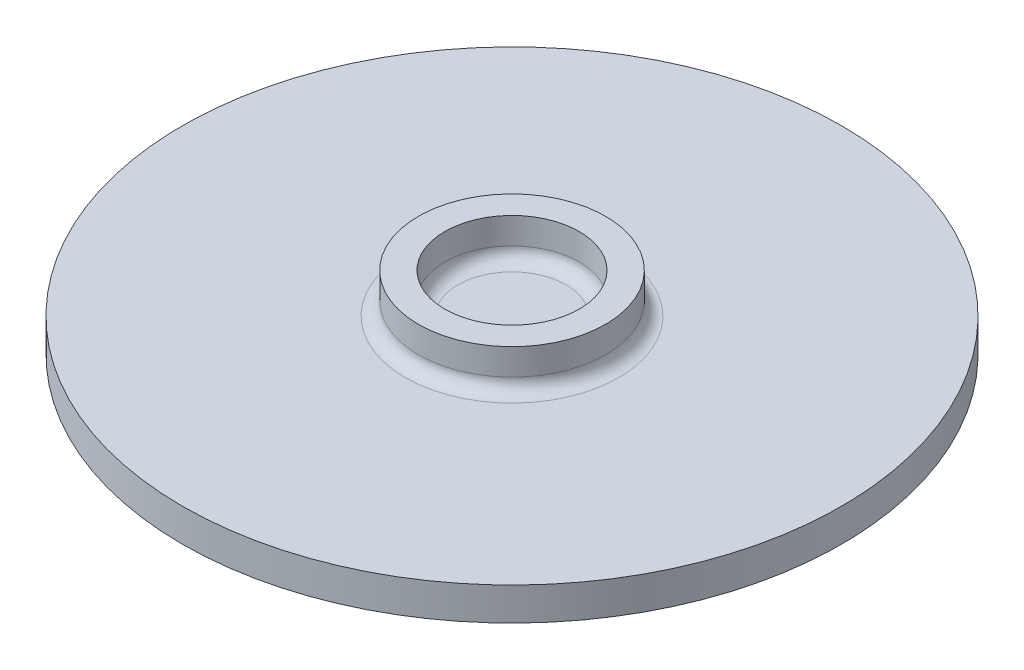
ISO-10303-21;
HEADER;
FILE_DESCRIPTION(('STEP AP214'),'2;1');
FILE_NAME('part.step','',(''),(''),'','','');
FILE_SCHEMA(('AUTOMOTIVE_DESIGN { 1 0 10303 214 1 1 1 1 }'));
ENDSEC;
DATA;
#1=APPLICATION_CONTEXT('core data for automotive mechanical design processes');
#2=APPLICATION_PROTOCOL_DEFINITION('international standard','automotive_design',2000,#1);
#3=PRODUCT_CONTEXT('',#1,'mechanical');
#4=PRODUCT('Part','Part','',(#3));
#5=PRODUCT_RELATED_PRODUCT_CATEGORY('part','',(#4));
#6=PRODUCT_DEFINITION_FORMATION('','',#4);
#7=PRODUCT_DEFINITION_CONTEXT('part definition',#1,'design');
#8=PRODUCT_DEFINITION('design','',#6,#7);
#9=PRODUCT_DEFINITION_SHAPE('','',#8);
#10=(LENGTH_UNIT() NAMED_UNIT(*) SI_UNIT(.MILLI.,.METRE.));
#11=(NAMED_UNIT(*) PLANE_ANGLE_UNIT() SI_UNIT($,.RADIAN.));
#12=(NAMED_UNIT(*) SI_UNIT($,.STERADIAN.) SOLID_ANGLE_UNIT());
#13=UNCERTAINTY_MEASURE_WITH_UNIT(LENGTH_MEASURE(1.E-05),#10,'distance_accuracy_value','');
#14=(GEOMETRIC_REPRESENTATION_CONTEXT(3) GLOBAL_UNCERTAINTY_ASSIGNED_CONTEXT((#13)) GLOBAL_UNIT_ASSIGNED_CONTEXT((#10,
#11,#12)) REPRESENTATION_CONTEXT('',''));
#15=CARTESIAN_POINT('',(0.,0.,0.));
#16=DIRECTION('',(0.,0.,1.));
#17=DIRECTION('',(1.,0.,0.));
#18=AXIS2_PLACEMENT_3D('',#15,#16,#17);
#19=CARTESIAN_POINT('',(0.,2.5,0.));
#20=DIRECTION('',(0.,-1.,0.));
#21=DIRECTION('',(0.,0.,-1.));
#22=AXIS2_PLACEMENT_3D('',#19,#20,#21);
#23=CYLINDRICAL_SURFACE('',#22,25.);
#24=CARTESIAN_POINT('',(0.,2.5,0.));
#25=DIRECTION('',(0.,1.,0.));
#26=DIRECTION('',(0.,0.,1.));
#27=AXIS2_PLACEMENT_3D('',#24,#25,#26);
#28=CIRCLE('',#27,25.);
#29=CARTESIAN_POINT('',(0.,2.5,25.));
#30=VERTEX_POINT('',#29);
#31=EDGE_CURVE('E56',#30,#30,#28,.T.);
#32=ORIENTED_EDGE('',*,*,#31,.F.);
#33=EDGE_LOOP('',(#32));
#34=FACE_BOUND('',#33,.T.);
#35=CARTESIAN_POINT('',(0.,0.,0.));
#36=DIRECTION('',(0.,1.,0.));
#37=DIRECTION('',(0.,0.,1.));
#38=AXIS2_PLACEMENT_3D('',#35,#36,#37);
#39=CIRCLE('',#38,25.);
#40=CARTESIAN_POINT('',(0.,0.,25.));
#41=VERTEX_POINT('',#40);
#42=EDGE_CURVE('E57',#41,#41,#39,.T.);
#43=ORIENTED_EDGE('',*,*,#42,.T.);
#44=EDGE_LOOP('',(#43));
#45=FACE_BOUND('',#44,.T.);
#46=ADVANCED_FACE('F36',(#34,#45),#23,.T.);
#47=CARTESIAN_POINT('',(0.,2.5,0.));
#48=DIRECTION('',(0.,1.,0.));
#49=DIRECTION('',(0.,0.,1.));
#50=AXIS2_PLACEMENT_3D('',#47,#48,#49);
#51=PLANE('',#50);
#52=CARTESIAN_POINT('',(0.,2.5,0.));
#53=DIRECTION('',(0.,1.,0.));
#54=DIRECTION('',(0.,0.,1.));
#55=AXIS2_PLACEMENT_3D('',#52,#53,#54);
#56=CIRCLE('',#55,8.10000000000001);
#57=CARTESIAN_POINT('',(0.,2.5,8.10000000000001));
#58=VERTEX_POINT('',#57);
#59=EDGE_CURVE('E10',#58,#58,#56,.F.);
#60=ORIENTED_EDGE('',*,*,#59,.T.);
#61=EDGE_LOOP('',(#60));
#62=FACE_BOUND('',#61,.T.);
#63=ORIENTED_EDGE('',*,*,#31,.T.);
#64=EDGE_LOOP('',(#63));
#65=FACE_BOUND('',#64,.T.);
#66=ADVANCED_FACE('F82',(#62,#65),#51,.T.);
#67=CARTESIAN_POINT('',(0.,0.,0.));
#68=DIRECTION('',(0.,1.,0.));
#69=DIRECTION('',(0.,0.,1.));
#70=AXIS2_PLACEMENT_3D('',#67,#68,#69);
#71=PLANE('',#70);
#72=ORIENTED_EDGE('',*,*,#42,.F.);
#73=EDGE_LOOP('',(#72));
#74=FACE_BOUND('',#73,.T.);
#75=ADVANCED_FACE('F74',(#74),#71,.F.);
#76=CARTESIAN_POINT('',(0.,5.5,0.));
#77=DIRECTION('',(0.,1.,0.));
#78=DIRECTION('',(0.,0.,1.));
#79=AXIS2_PLACEMENT_3D('',#76,#77,#78);
#80=PLANE('',#79);
#81=CARTESIAN_POINT('',(0.,5.5,0.));
#82=DIRECTION('',(0.,1.,0.));
#83=DIRECTION('',(0.,0.,1.));
#84=AXIS2_PLACEMENT_3D('',#81,#82,#83);
#85=CIRCLE('',#84,7.10000000000001);
#86=CARTESIAN_POINT('',(0.,5.5,7.10000000000001));
#87=VERTEX_POINT('',#86);
#88=EDGE_CURVE('E60',#87,#87,#85,.T.);
#89=ORIENTED_EDGE('',*,*,#88,.T.);
#90=EDGE_LOOP('',(#89));
#91=FACE_BOUND('',#90,.T.);
#92=CARTESIAN_POINT('',(0.,5.5,0.));
#93=DIRECTION('',(0.,1.,0.));
#94=DIRECTION('',(0.,0.,1.));
#95=AXIS2_PLACEMENT_3D('',#92,#93,#94);
#96=CIRCLE('',#95,5.10000000000001);
#97=CARTESIAN_POINT('',(0.,5.5,5.10000000000001));
#98=VERTEX_POINT('',#97);
#99=EDGE_CURVE('E65',#98,#98,#96,.T.);
#100=ORIENTED_EDGE('',*,*,#99,.F.);
#101=EDGE_LOOP('',(#100));
#102=FACE_BOUND('',#101,.T.);
#103=ADVANCED_FACE('F71',(#91,#102),#80,.T.);
#104=CARTESIAN_POINT('',(0.,5.5,0.));
#105=DIRECTION('',(0.,-1.,0.));
#106=DIRECTION('',(0.,0.,-1.));
#107=AXIS2_PLACEMENT_3D('',#104,#105,#106);
#108=CYLINDRICAL_SURFACE('',#107,7.10000000000001);
#109=CARTESIAN_POINT('',(0.,3.5,0.));
#110=DIRECTION('',(0.,1.,0.));
#111=DIRECTION('',(0.,0.,1.));
#112=AXIS2_PLACEMENT_3D('',#109,#110,#111);
#113=CIRCLE('',#112,7.10000000000001);
#114=CARTESIAN_POINT('',(0.,3.5,7.10000000000001));
#115=VERTEX_POINT('',#114);
#116=EDGE_CURVE('E43',#115,#115,#113,.T.);
#117=ORIENTED_EDGE('',*,*,#116,.T.);
#118=EDGE_LOOP('',(#117));
#119=FACE_BOUND('',#118,.T.);
#120=ORIENTED_EDGE('',*,*,#88,.F.);
#121=EDGE_LOOP('',(#120));
#122=FACE_BOUND('',#121,.T.);
#123=ADVANCED_FACE('F73',(#119,#122),#108,.T.);
#124=CARTESIAN_POINT('',(0.,5.5,0.));
#125=DIRECTION('',(0.,-1.,0.));
#126=DIRECTION('',(0.,0.,-1.));
#127=AXIS2_PLACEMENT_3D('',#124,#125,#126);
#128=CYLINDRICAL_SURFACE('',#127,5.10000000000001);
#129=CARTESIAN_POINT('',(0.,3.5,0.));
#130=DIRECTION('',(0.,1.,0.));
#131=DIRECTION('',(0.,0.,1.));
#132=AXIS2_PLACEMENT_3D('',#129,#130,#131);
#133=CIRCLE('',#132,5.10000000000001);
#134=CARTESIAN_POINT('',(0.,3.5,5.10000000000001));
#135=VERTEX_POINT('',#134);
#136=EDGE_CURVE('E51',#135,#135,#133,.F.);
#137=ORIENTED_EDGE('',*,*,#136,.T.);
#138=EDGE_LOOP('',(#137));
#139=FACE_BOUND('',#138,.T.);
#140=ORIENTED_EDGE('',*,*,#99,.T.);
#141=EDGE_LOOP('',(#140));
#142=FACE_BOUND('',#141,.T.);
#143=ADVANCED_FACE('F69',(#139,#142),#128,.F.);
#144=CARTESIAN_POINT('',(0.,2.5,0.));
#145=DIRECTION('',(0.,1.,0.));
#146=DIRECTION('',(0.,0.,1.));
#147=AXIS2_PLACEMENT_3D('',#144,#145,#146);
#148=CIRCLE('',#147,4.10000000000001);
#149=CARTESIAN_POINT('',(0.,2.5,4.10000000000001));
#150=VERTEX_POINT('',#149);
#151=EDGE_CURVE('E47',#150,#150,#148,.T.);
#152=ORIENTED_EDGE('',*,*,#151,.T.);
#153=EDGE_LOOP('',(#152));
#154=FACE_BOUND('',#153,.T.);
#155=ADVANCED_FACE('F93',(#154),#51,.T.);
#156=CARTESIAN_POINT('',(0.,3.5,0.));
#157=DIRECTION('',(0.,1.,0.));
#158=DIRECTION('',(0.,0.,1.));
#159=AXIS2_PLACEMENT_3D('',#156,#157,#158);
#160=TOROIDAL_SURFACE('',#159,4.10000000000001,1.);
#161=ORIENTED_EDGE('',*,*,#151,.F.);
#162=EDGE_LOOP('',(#161));
#163=FACE_BOUND('',#162,.T.);
#164=ORIENTED_EDGE('',*,*,#136,.F.);
#165=EDGE_LOOP('',(#164));
#166=FACE_BOUND('',#165,.T.);
#167=ADVANCED_FACE('F96',(#163,#166),#160,.F.);
#168=CARTESIAN_POINT('',(0.,3.5,0.));
#169=DIRECTION('',(0.,1.,0.));
#170=DIRECTION('',(0.,0.,1.));
#171=AXIS2_PLACEMENT_3D('',#168,#169,#170);
#172=TOROIDAL_SURFACE('',#171,8.10000000000001,1.);
#173=ORIENTED_EDGE('',*,*,#59,.F.);
#174=EDGE_LOOP('',(#173));
#175=FACE_BOUND('',#174,.T.);
#176=ORIENTED_EDGE('',*,*,#116,.F.);
#177=EDGE_LOOP('',(#176));
#178=FACE_BOUND('',#177,.T.);
#179=ADVANCED_FACE('F38',(#175,#178),#172,.F.);
#180=CLOSED_SHELL('',(#46,#66,#75,#103,#123,#143,#155,#167,#179));
#181=MANIFOLD_SOLID_BREP('B2',#180);
#182=ADVANCED_BREP_SHAPE_REPRESENTATION('',(#18,#181),#14);
#183=SHAPE_DEFINITION_REPRESENTATION(#9,#182);
ENDSEC;
END-ISO-10303-21;
